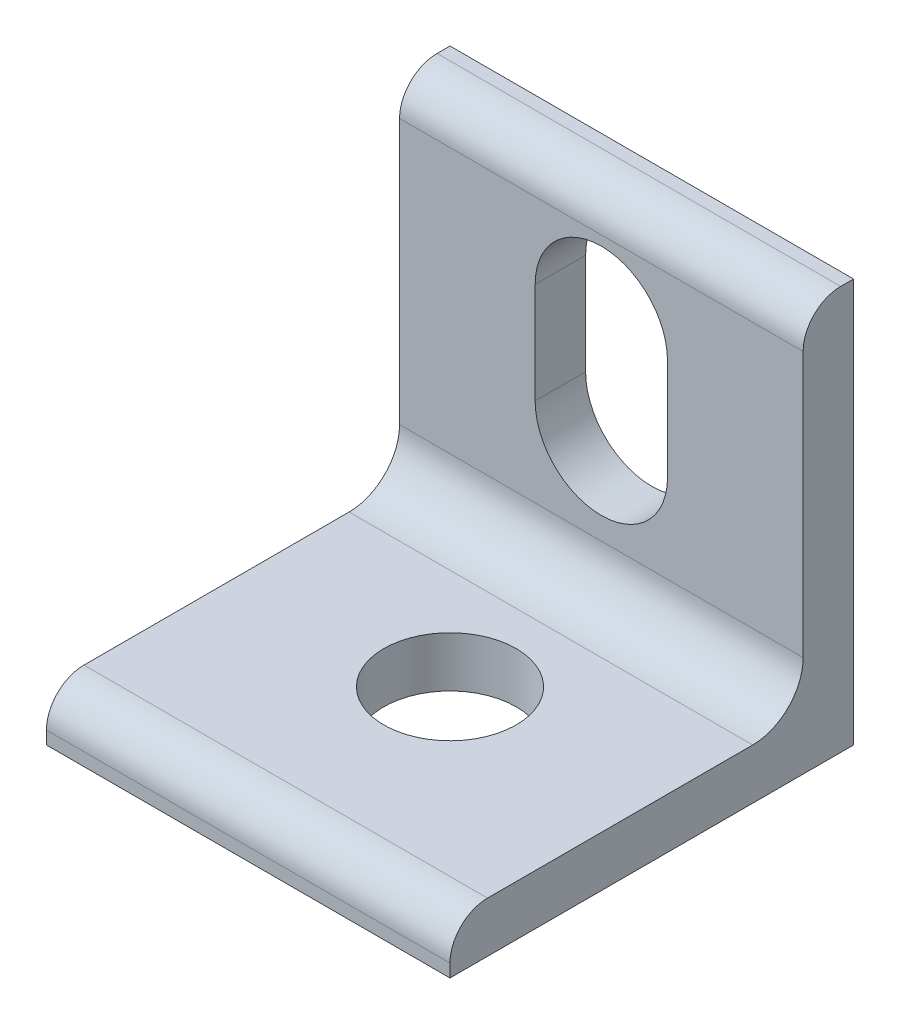
ISO-10303-21;
HEADER;
FILE_DESCRIPTION(('STEP AP214'),'2;1');
FILE_NAME('part.step','',(''),(''),'','','');
FILE_SCHEMA(('AUTOMOTIVE_DESIGN { 1 0 10303 214 1 1 1 1 }'));
ENDSEC;
DATA;
#1=APPLICATION_CONTEXT('core data for automotive mechanical design processes');
#2=APPLICATION_PROTOCOL_DEFINITION('international standard','automotive_design',2000,#1);
#3=PRODUCT_CONTEXT('',#1,'mechanical');
#4=PRODUCT('Part','Part','',(#3));
#5=PRODUCT_RELATED_PRODUCT_CATEGORY('part','',(#4));
#6=PRODUCT_DEFINITION_FORMATION('','',#4);
#7=PRODUCT_DEFINITION_CONTEXT('part definition',#1,'design');
#8=PRODUCT_DEFINITION('design','',#6,#7);
#9=PRODUCT_DEFINITION_SHAPE('','',#8);
#10=(LENGTH_UNIT() NAMED_UNIT(*) SI_UNIT(.MILLI.,.METRE.));
#11=(NAMED_UNIT(*) PLANE_ANGLE_UNIT() SI_UNIT($,.RADIAN.));
#12=(NAMED_UNIT(*) SI_UNIT($,.STERADIAN.) SOLID_ANGLE_UNIT());
#13=UNCERTAINTY_MEASURE_WITH_UNIT(LENGTH_MEASURE(1.E-05),#10,'distance_accuracy_value','');
#14=(GEOMETRIC_REPRESENTATION_CONTEXT(3) GLOBAL_UNCERTAINTY_ASSIGNED_CONTEXT((#13)) GLOBAL_UNIT_ASSIGNED_CONTEXT((#10,
#11,#12)) REPRESENTATION_CONTEXT('',''));
#15=CARTESIAN_POINT('',(0.,0.,0.));
#16=DIRECTION('',(0.,0.,1.));
#17=DIRECTION('',(1.,0.,0.));
#18=AXIS2_PLACEMENT_3D('',#15,#16,#17);
#19=CARTESIAN_POINT('',(-12.7,0.,0.));
#20=DIRECTION('',(0.,0.,-1.));
#21=DIRECTION('',(-1.,0.,0.));
#22=AXIS2_PLACEMENT_3D('',#19,#20,#21);
#23=PLANE('',#22);
#24=CARTESIAN_POINT('',(0.,18.2626,0.));
#25=DIRECTION('',(0.,0.,-1.));
#26=DIRECTION('',(-1.,0.,0.));
#27=AXIS2_PLACEMENT_3D('',#24,#25,#26);
#28=CIRCLE('',#27,4.1656);
#29=CARTESIAN_POINT('',(-4.1656,18.2626,0.));
#30=VERTEX_POINT('',#29);
#31=CARTESIAN_POINT('',(4.1656,18.2626,0.));
#32=VERTEX_POINT('',#31);
#33=EDGE_CURVE('E149',#30,#32,#28,.T.);
#34=ORIENTED_EDGE('',*,*,#33,.F.);
#35=DIRECTION('',(0.,1.,0.));
#36=VECTOR('',#35,1.);
#37=CARTESIAN_POINT('',(-4.1656,11.9126,0.));
#38=LINE('',#37,#36);
#39=CARTESIAN_POINT('',(-4.1656,11.9126,0.));
#40=VERTEX_POINT('',#39);
#41=EDGE_CURVE('E153',#40,#30,#38,.T.);
#42=ORIENTED_EDGE('',*,*,#41,.F.);
#43=CARTESIAN_POINT('',(0.,11.9126,0.));
#44=DIRECTION('',(0.,0.,-1.));
#45=DIRECTION('',(-1.,0.,0.));
#46=AXIS2_PLACEMENT_3D('',#43,#44,#45);
#47=CIRCLE('',#46,4.1656);
#48=CARTESIAN_POINT('',(4.1656,11.9126,0.));
#49=VERTEX_POINT('',#48);
#50=EDGE_CURVE('E133',#49,#40,#47,.T.);
#51=ORIENTED_EDGE('',*,*,#50,.F.);
#52=DIRECTION('',(0.,-1.,0.));
#53=VECTOR('',#52,1.);
#54=CARTESIAN_POINT('',(4.1656,18.2626,0.));
#55=LINE('',#54,#53);
#56=EDGE_CURVE('E144',#32,#49,#55,.T.);
#57=ORIENTED_EDGE('',*,*,#56,.F.);
#58=EDGE_LOOP('',(#34,#42,#51,#57));
#59=FACE_BOUND('',#58,.T.);
#60=DIRECTION('',(0.,1.,0.));
#61=VECTOR('',#60,1.);
#62=CARTESIAN_POINT('',(12.7,0.,0.));
#63=LINE('',#62,#61);
#64=CARTESIAN_POINT('',(12.7,0.,0.));
#65=VERTEX_POINT('',#64);
#66=CARTESIAN_POINT('',(12.7,25.4,0.));
#67=VERTEX_POINT('',#66);
#68=EDGE_CURVE('E168',#65,#67,#63,.T.);
#69=ORIENTED_EDGE('',*,*,#68,.F.);
#70=DIRECTION('',(1.,0.,0.));
#71=VECTOR('',#70,1.);
#72=CARTESIAN_POINT('',(-12.7,0.,0.));
#73=LINE('',#72,#71);
#74=CARTESIAN_POINT('',(-12.7,0.,0.));
#75=VERTEX_POINT('',#74);
#76=EDGE_CURVE('E193',#75,#65,#73,.T.);
#77=ORIENTED_EDGE('',*,*,#76,.F.);
#78=DIRECTION('',(0.,1.,0.));
#79=VECTOR('',#78,1.);
#80=CARTESIAN_POINT('',(-12.7,0.,0.));
#81=LINE('',#80,#79);
#82=CARTESIAN_POINT('',(-12.7,25.4,0.));
#83=VERTEX_POINT('',#82);
#84=EDGE_CURVE('E171',#75,#83,#81,.T.);
#85=ORIENTED_EDGE('',*,*,#84,.T.);
#86=DIRECTION('',(1.,0.,0.));
#87=VECTOR('',#86,1.);
#88=CARTESIAN_POINT('',(-12.7,25.4,0.));
#89=LINE('',#88,#87);
#90=EDGE_CURVE('E183',#83,#67,#89,.T.);
#91=ORIENTED_EDGE('',*,*,#90,.T.);
#92=EDGE_LOOP('',(#69,#77,#85,#91));
#93=FACE_BOUND('',#92,.T.);
#94=ADVANCED_FACE('F33',(#59,#93),#23,.T.);
#95=CARTESIAN_POINT('',(-12.7,0.,25.4));
#96=DIRECTION('',(0.,-1.,0.));
#97=DIRECTION('',(0.,0.,-1.));
#98=AXIS2_PLACEMENT_3D('',#95,#96,#97);
#99=PLANE('',#98);
#100=CARTESIAN_POINT('',(0.,0.,12.7));
#101=DIRECTION('',(0.,-1.,0.));
#102=DIRECTION('',(0.,0.,-1.));
#103=AXIS2_PLACEMENT_3D('',#100,#101,#102);
#104=CIRCLE('',#103,4.16559999999999);
#105=CARTESIAN_POINT('',(0.,0.,8.53440000000001));
#106=VERTEX_POINT('',#105);
#107=EDGE_CURVE('E212',#106,#106,#104,.T.);
#108=ORIENTED_EDGE('',*,*,#107,.F.);
#109=EDGE_LOOP('',(#108));
#110=FACE_BOUND('',#109,.T.);
#111=DIRECTION('',(0.,0.,-1.));
#112=VECTOR('',#111,1.);
#113=CARTESIAN_POINT('',(12.7,0.,25.4));
#114=LINE('',#113,#112);
#115=CARTESIAN_POINT('',(12.7,0.,25.4));
#116=VERTEX_POINT('',#115);
#117=EDGE_CURVE('E175',#116,#65,#114,.T.);
#118=ORIENTED_EDGE('',*,*,#117,.F.);
#119=DIRECTION('',(1.,0.,0.));
#120=VECTOR('',#119,1.);
#121=CARTESIAN_POINT('',(-12.7,0.,25.4));
#122=LINE('',#121,#120);
#123=CARTESIAN_POINT('',(-12.7,0.,25.4));
#124=VERTEX_POINT('',#123);
#125=EDGE_CURVE('E196',#124,#116,#122,.T.);
#126=ORIENTED_EDGE('',*,*,#125,.F.);
#127=DIRECTION('',(0.,0.,-1.));
#128=VECTOR('',#127,1.);
#129=CARTESIAN_POINT('',(-12.7,0.,25.4));
#130=LINE('',#129,#128);
#131=EDGE_CURVE('E180',#124,#75,#130,.T.);
#132=ORIENTED_EDGE('',*,*,#131,.T.);
#133=ORIENTED_EDGE('',*,*,#76,.T.);
#134=EDGE_LOOP('',(#118,#126,#132,#133));
#135=FACE_BOUND('',#134,.T.);
#136=ADVANCED_FACE('F257',(#110,#135),#99,.T.);
#137=CARTESIAN_POINT('',(-12.7,25.4,25.4));
#138=DIRECTION('',(0.,0.,1.));
#139=DIRECTION('',(1.,0.,0.));
#140=AXIS2_PLACEMENT_3D('',#137,#138,#139);
#141=PLANE('',#140);
#142=DIRECTION('',(0.,-1.,0.));
#143=VECTOR('',#142,1.);
#144=CARTESIAN_POINT('',(12.7,25.4,25.4));
#145=LINE('',#144,#143);
#146=CARTESIAN_POINT('',(12.7,0.812800000000002,25.4));
#147=VERTEX_POINT('',#146);
#148=EDGE_CURVE('E189',#147,#116,#145,.T.);
#149=ORIENTED_EDGE('',*,*,#148,.F.);
#150=DIRECTION('',(-1.,0.,0.));
#151=VECTOR('',#150,1.);
#152=CARTESIAN_POINT('',(-12.7,0.812800000000002,25.4));
#153=LINE('',#152,#151);
#154=CARTESIAN_POINT('',(-12.7,0.812800000000002,25.4));
#155=VERTEX_POINT('',#154);
#156=EDGE_CURVE('E208',#147,#155,#153,.T.);
#157=ORIENTED_EDGE('',*,*,#156,.T.);
#158=DIRECTION('',(0.,-1.,0.));
#159=VECTOR('',#158,1.);
#160=CARTESIAN_POINT('',(-12.7,25.4,25.4));
#161=LINE('',#160,#159);
#162=EDGE_CURVE('E178',#155,#124,#161,.T.);
#163=ORIENTED_EDGE('',*,*,#162,.T.);
#164=ORIENTED_EDGE('',*,*,#125,.T.);
#165=EDGE_LOOP('',(#149,#157,#163,#164));
#166=FACE_BOUND('',#165,.T.);
#167=ADVANCED_FACE('F253',(#166),#141,.T.);
#168=CARTESIAN_POINT('',(-12.7,25.4,0.));
#169=DIRECTION('',(0.,1.,0.));
#170=DIRECTION('',(0.,0.,1.));
#171=AXIS2_PLACEMENT_3D('',#168,#169,#170);
#172=PLANE('',#171);
#173=DIRECTION('',(0.,0.,1.));
#174=VECTOR('',#173,1.);
#175=CARTESIAN_POINT('',(-12.7,25.4,0.));
#176=LINE('',#175,#174);
#177=CARTESIAN_POINT('',(-12.7,25.4,0.812800000000002));
#178=VERTEX_POINT('',#177);
#179=EDGE_CURVE('E174',#83,#178,#176,.T.);
#180=ORIENTED_EDGE('',*,*,#179,.T.);
#181=DIRECTION('',(-1.,0.,0.));
#182=VECTOR('',#181,1.);
#183=CARTESIAN_POINT('',(12.7,25.4,0.812800000000002));
#184=LINE('',#183,#182);
#185=CARTESIAN_POINT('',(12.7,25.4,0.812800000000002));
#186=VERTEX_POINT('',#185);
#187=EDGE_CURVE('E230',#178,#186,#184,.F.);
#188=ORIENTED_EDGE('',*,*,#187,.T.);
#189=DIRECTION('',(0.,0.,1.));
#190=VECTOR('',#189,1.);
#191=CARTESIAN_POINT('',(12.7,25.4,0.));
#192=LINE('',#191,#190);
#193=EDGE_CURVE('E186',#67,#186,#192,.T.);
#194=ORIENTED_EDGE('',*,*,#193,.F.);
#195=ORIENTED_EDGE('',*,*,#90,.F.);
#196=EDGE_LOOP('',(#180,#188,#194,#195));
#197=FACE_BOUND('',#196,.T.);
#198=ADVANCED_FACE('F264',(#197),#172,.T.);
#199=CARTESIAN_POINT('',(-12.7,0.,0.));
#200=DIRECTION('',(1.,0.,0.));
#201=DIRECTION('',(0.,0.,-1.));
#202=AXIS2_PLACEMENT_3D('',#199,#200,#201);
#203=PLANE('',#202);
#204=ORIENTED_EDGE('',*,*,#162,.F.);
#205=CARTESIAN_POINT('',(-12.7,0.812800000000002,23.0378));
#206=DIRECTION('',(1.,0.,0.));
#207=DIRECTION('',(0.,0.,-1.));
#208=AXIS2_PLACEMENT_3D('',#205,#206,#207);
#209=CIRCLE('',#208,2.3622);
#210=CARTESIAN_POINT('',(-12.7,3.175,23.0378));
#211=VERTEX_POINT('',#210);
#212=EDGE_CURVE('E217',#155,#211,#209,.F.);
#213=ORIENTED_EDGE('',*,*,#212,.T.);
#214=DIRECTION('',(0.,0.,1.));
#215=VECTOR('',#214,1.);
#216=CARTESIAN_POINT('',(-12.7,3.175,3.175));
#217=LINE('',#216,#215);
#218=CARTESIAN_POINT('',(-12.7,3.175,6.35));
#219=VERTEX_POINT('',#218);
#220=EDGE_CURVE('E166',#219,#211,#217,.T.);
#221=ORIENTED_EDGE('',*,*,#220,.F.);
#222=CARTESIAN_POINT('',(-12.7,6.35,6.35));
#223=DIRECTION('',(1.,0.,0.));
#224=DIRECTION('',(0.,0.,-1.));
#225=AXIS2_PLACEMENT_3D('',#222,#223,#224);
#226=CIRCLE('',#225,3.175);
#227=CARTESIAN_POINT('',(-12.7,6.35,3.175));
#228=VERTEX_POINT('',#227);
#229=EDGE_CURVE('E41',#219,#228,#226,.T.);
#230=ORIENTED_EDGE('',*,*,#229,.T.);
#231=DIRECTION('',(0.,-1.,0.));
#232=VECTOR('',#231,1.);
#233=CARTESIAN_POINT('',(-12.7,25.4,3.175));
#234=LINE('',#233,#232);
#235=CARTESIAN_POINT('',(-12.7,23.0378,3.175));
#236=VERTEX_POINT('',#235);
#237=EDGE_CURVE('E160',#236,#228,#234,.T.);
#238=ORIENTED_EDGE('',*,*,#237,.F.);
#239=CARTESIAN_POINT('',(-12.7,23.0378,0.812800000000002));
#240=DIRECTION('',(1.,0.,0.));
#241=DIRECTION('',(0.,0.,-1.));
#242=AXIS2_PLACEMENT_3D('',#239,#240,#241);
#243=CIRCLE('',#242,2.3622);
#244=EDGE_CURVE('E215',#236,#178,#243,.F.);
#245=ORIENTED_EDGE('',*,*,#244,.T.);
#246=ORIENTED_EDGE('',*,*,#179,.F.);
#247=ORIENTED_EDGE('',*,*,#84,.F.);
#248=ORIENTED_EDGE('',*,*,#131,.F.);
#249=EDGE_LOOP('',(#204,#213,#221,#230,#238,#245,#246,#247,#248));
#250=FACE_BOUND('',#249,.T.);
#251=ADVANCED_FACE('F242',(#250),#203,.F.);
#252=CARTESIAN_POINT('',(12.7,0.,0.));
#253=DIRECTION('',(1.,0.,0.));
#254=DIRECTION('',(0.,0.,-1.));
#255=AXIS2_PLACEMENT_3D('',#252,#253,#254);
#256=PLANE('',#255);
#257=DIRECTION('',(0.,-1.,0.));
#258=VECTOR('',#257,1.);
#259=CARTESIAN_POINT('',(12.7,25.4,3.175));
#260=LINE('',#259,#258);
#261=CARTESIAN_POINT('',(12.7,23.0378,3.175));
#262=VERTEX_POINT('',#261);
#263=CARTESIAN_POINT('',(12.7,6.35,3.175));
#264=VERTEX_POINT('',#263);
#265=EDGE_CURVE('E163',#262,#264,#260,.T.);
#266=ORIENTED_EDGE('',*,*,#265,.T.);
#267=CARTESIAN_POINT('',(12.7,6.35,6.35));
#268=DIRECTION('',(1.,0.,0.));
#269=DIRECTION('',(0.,0.,-1.));
#270=AXIS2_PLACEMENT_3D('',#267,#268,#269);
#271=CIRCLE('',#270,3.175);
#272=CARTESIAN_POINT('',(12.7,3.175,6.35));
#273=VERTEX_POINT('',#272);
#274=EDGE_CURVE('E11',#264,#273,#271,.F.);
#275=ORIENTED_EDGE('',*,*,#274,.T.);
#276=DIRECTION('',(0.,0.,1.));
#277=VECTOR('',#276,1.);
#278=CARTESIAN_POINT('',(12.7,3.175,3.175));
#279=LINE('',#278,#277);
#280=CARTESIAN_POINT('',(12.7,3.175,23.0378));
#281=VERTEX_POINT('',#280);
#282=EDGE_CURVE('E165',#273,#281,#279,.T.);
#283=ORIENTED_EDGE('',*,*,#282,.T.);
#284=CARTESIAN_POINT('',(12.7,0.812800000000002,23.0378));
#285=DIRECTION('',(1.,0.,0.));
#286=DIRECTION('',(0.,0.,-1.));
#287=AXIS2_PLACEMENT_3D('',#284,#285,#286);
#288=CIRCLE('',#287,2.3622);
#289=EDGE_CURVE('E225',#281,#147,#288,.T.);
#290=ORIENTED_EDGE('',*,*,#289,.T.);
#291=ORIENTED_EDGE('',*,*,#148,.T.);
#292=ORIENTED_EDGE('',*,*,#117,.T.);
#293=ORIENTED_EDGE('',*,*,#68,.T.);
#294=ORIENTED_EDGE('',*,*,#193,.T.);
#295=CARTESIAN_POINT('',(12.7,23.0378,0.812800000000002));
#296=DIRECTION('',(1.,0.,0.));
#297=DIRECTION('',(0.,0.,-1.));
#298=AXIS2_PLACEMENT_3D('',#295,#296,#297);
#299=CIRCLE('',#298,2.3622);
#300=EDGE_CURVE('E223',#186,#262,#299,.T.);
#301=ORIENTED_EDGE('',*,*,#300,.T.);
#302=EDGE_LOOP('',(#266,#275,#283,#290,#291,#292,#293,#294,#301));
#303=FACE_BOUND('',#302,.T.);
#304=ADVANCED_FACE('F251',(#303),#256,.T.);
#305=CARTESIAN_POINT('',(12.7,25.4,3.175));
#306=DIRECTION('',(0.,0.,-1.));
#307=DIRECTION('',(-1.,0.,0.));
#308=AXIS2_PLACEMENT_3D('',#305,#306,#307);
#309=PLANE('',#308);
#310=DIRECTION('',(0.,1.,0.));
#311=VECTOR('',#310,1.);
#312=CARTESIAN_POINT('',(-4.1656,25.4,3.175));
#313=LINE('',#312,#311);
#314=CARTESIAN_POINT('',(-4.1656,11.9126,3.175));
#315=VERTEX_POINT('',#314);
#316=CARTESIAN_POINT('',(-4.1656,18.2626,3.175));
#317=VERTEX_POINT('',#316);
#318=EDGE_CURVE('E202',#315,#317,#313,.T.);
#319=ORIENTED_EDGE('',*,*,#318,.T.);
#320=CARTESIAN_POINT('',(0.,18.2626,3.175));
#321=DIRECTION('',(0.,0.,-1.));
#322=DIRECTION('',(-1.,0.,0.));
#323=AXIS2_PLACEMENT_3D('',#320,#321,#322);
#324=CIRCLE('',#323,4.1656);
#325=CARTESIAN_POINT('',(4.1656,18.2626,3.175));
#326=VERTEX_POINT('',#325);
#327=EDGE_CURVE('E205',#317,#326,#324,.T.);
#328=ORIENTED_EDGE('',*,*,#327,.T.);
#329=DIRECTION('',(0.,-1.,0.));
#330=VECTOR('',#329,1.);
#331=CARTESIAN_POINT('',(4.1656,25.4,3.175));
#332=LINE('',#331,#330);
#333=CARTESIAN_POINT('',(4.1656,11.9126,3.175));
#334=VERTEX_POINT('',#333);
#335=EDGE_CURVE('E195',#326,#334,#332,.T.);
#336=ORIENTED_EDGE('',*,*,#335,.T.);
#337=CARTESIAN_POINT('',(0.,11.9126,3.175));
#338=DIRECTION('',(0.,0.,-1.));
#339=DIRECTION('',(-1.,0.,0.));
#340=AXIS2_PLACEMENT_3D('',#337,#338,#339);
#341=CIRCLE('',#340,4.1656);
#342=EDGE_CURVE('E136',#334,#315,#341,.T.);
#343=ORIENTED_EDGE('',*,*,#342,.T.);
#344=EDGE_LOOP('',(#319,#328,#336,#343));
#345=FACE_BOUND('',#344,.T.);
#346=ORIENTED_EDGE('',*,*,#237,.T.);
#347=DIRECTION('',(-1.,0.,0.));
#348=VECTOR('',#347,1.);
#349=CARTESIAN_POINT('',(12.7,6.35,3.175));
#350=LINE('',#349,#348);
#351=EDGE_CURVE('E54',#228,#264,#350,.F.);
#352=ORIENTED_EDGE('',*,*,#351,.T.);
#353=ORIENTED_EDGE('',*,*,#265,.F.);
#354=DIRECTION('',(-1.,0.,0.));
#355=VECTOR('',#354,1.);
#356=CARTESIAN_POINT('',(-12.7,23.0378,3.175));
#357=LINE('',#356,#355);
#358=EDGE_CURVE('E227',#262,#236,#357,.T.);
#359=ORIENTED_EDGE('',*,*,#358,.T.);
#360=EDGE_LOOP('',(#346,#352,#353,#359));
#361=FACE_BOUND('',#360,.T.);
#362=ADVANCED_FACE('F269',(#345,#361),#309,.F.);
#363=CARTESIAN_POINT('',(12.7,3.175,3.175));
#364=DIRECTION('',(0.,-1.,0.));
#365=DIRECTION('',(0.,0.,-1.));
#366=AXIS2_PLACEMENT_3D('',#363,#364,#365);
#367=PLANE('',#366);
#368=CARTESIAN_POINT('',(0.,3.175,12.7));
#369=DIRECTION('',(0.,-1.,0.));
#370=DIRECTION('',(0.,0.,-1.));
#371=AXIS2_PLACEMENT_3D('',#368,#369,#370);
#372=CIRCLE('',#371,4.16559999999999);
#373=CARTESIAN_POINT('',(0.,3.175,8.53440000000001));
#374=VERTEX_POINT('',#373);
#375=EDGE_CURVE('E209',#374,#374,#372,.T.);
#376=ORIENTED_EDGE('',*,*,#375,.T.);
#377=EDGE_LOOP('',(#376));
#378=FACE_BOUND('',#377,.T.);
#379=ORIENTED_EDGE('',*,*,#282,.F.);
#380=DIRECTION('',(-1.,0.,0.));
#381=VECTOR('',#380,1.);
#382=CARTESIAN_POINT('',(-12.7,3.175,6.35));
#383=LINE('',#382,#381);
#384=EDGE_CURVE('E232',#273,#219,#383,.T.);
#385=ORIENTED_EDGE('',*,*,#384,.T.);
#386=ORIENTED_EDGE('',*,*,#220,.T.);
#387=DIRECTION('',(-1.,0.,0.));
#388=VECTOR('',#387,1.);
#389=CARTESIAN_POINT('',(12.7,3.175,23.0378));
#390=LINE('',#389,#388);
#391=EDGE_CURVE('E220',#211,#281,#390,.F.);
#392=ORIENTED_EDGE('',*,*,#391,.T.);
#393=EDGE_LOOP('',(#379,#385,#386,#392));
#394=FACE_BOUND('',#393,.T.);
#395=ADVANCED_FACE('F238',(#378,#394),#367,.F.);
#396=CARTESIAN_POINT('',(0.,18.2626,25.4));
#397=DIRECTION('',(0.,0.,-1.));
#398=DIRECTION('',(-1.,0.,0.));
#399=AXIS2_PLACEMENT_3D('',#396,#397,#398);
#400=CYLINDRICAL_SURFACE('',#399,4.1656);
#401=DIRECTION('',(0.,0.,-1.));
#402=VECTOR('',#401,1.);
#403=CARTESIAN_POINT('',(-4.1656,18.2626,25.4));
#404=LINE('',#403,#402);
#405=EDGE_CURVE('E158',#317,#30,#404,.T.);
#406=ORIENTED_EDGE('',*,*,#405,.T.);
#407=ORIENTED_EDGE('',*,*,#33,.T.);
#408=DIRECTION('',(0.,0.,-1.));
#409=VECTOR('',#408,1.);
#410=CARTESIAN_POINT('',(4.1656,18.2626,25.4));
#411=LINE('',#410,#409);
#412=EDGE_CURVE('E140',#326,#32,#411,.T.);
#413=ORIENTED_EDGE('',*,*,#412,.F.);
#414=ORIENTED_EDGE('',*,*,#327,.F.);
#415=EDGE_LOOP('',(#406,#407,#413,#414));
#416=FACE_BOUND('',#415,.T.);
#417=ADVANCED_FACE('F301',(#416),#400,.F.);
#418=CARTESIAN_POINT('',(-4.1656,11.9126,25.4));
#419=DIRECTION('',(-1.,0.,0.));
#420=DIRECTION('',(0.,0.,1.));
#421=AXIS2_PLACEMENT_3D('',#418,#419,#420);
#422=PLANE('',#421);
#423=DIRECTION('',(0.,0.,-1.));
#424=VECTOR('',#423,1.);
#425=CARTESIAN_POINT('',(-4.1656,11.9126,25.4));
#426=LINE('',#425,#424);
#427=EDGE_CURVE('E139',#315,#40,#426,.T.);
#428=ORIENTED_EDGE('',*,*,#427,.T.);
#429=ORIENTED_EDGE('',*,*,#41,.T.);
#430=ORIENTED_EDGE('',*,*,#405,.F.);
#431=ORIENTED_EDGE('',*,*,#318,.F.);
#432=EDGE_LOOP('',(#428,#429,#430,#431));
#433=FACE_BOUND('',#432,.T.);
#434=ADVANCED_FACE('F298',(#433),#422,.F.);
#435=CARTESIAN_POINT('',(0.,11.9126,25.4));
#436=DIRECTION('',(0.,0.,-1.));
#437=DIRECTION('',(-1.,0.,0.));
#438=AXIS2_PLACEMENT_3D('',#435,#436,#437);
#439=CYLINDRICAL_SURFACE('',#438,4.1656);
#440=DIRECTION('',(0.,0.,-1.));
#441=VECTOR('',#440,1.);
#442=CARTESIAN_POINT('',(4.1656,11.9126,25.4));
#443=LINE('',#442,#441);
#444=EDGE_CURVE('E128',#334,#49,#443,.T.);
#445=ORIENTED_EDGE('',*,*,#444,.T.);
#446=ORIENTED_EDGE('',*,*,#50,.T.);
#447=ORIENTED_EDGE('',*,*,#427,.F.);
#448=ORIENTED_EDGE('',*,*,#342,.F.);
#449=EDGE_LOOP('',(#445,#446,#447,#448));
#450=FACE_BOUND('',#449,.T.);
#451=ADVANCED_FACE('F130',(#450),#439,.F.);
#452=CARTESIAN_POINT('',(4.1656,18.2626,25.4));
#453=DIRECTION('',(1.,0.,0.));
#454=DIRECTION('',(0.,0.,-1.));
#455=AXIS2_PLACEMENT_3D('',#452,#453,#454);
#456=PLANE('',#455);
#457=ORIENTED_EDGE('',*,*,#412,.T.);
#458=ORIENTED_EDGE('',*,*,#56,.T.);
#459=ORIENTED_EDGE('',*,*,#444,.F.);
#460=ORIENTED_EDGE('',*,*,#335,.F.);
#461=EDGE_LOOP('',(#457,#458,#459,#460));
#462=FACE_BOUND('',#461,.T.);
#463=ADVANCED_FACE('F145',(#462),#456,.F.);
#464=CARTESIAN_POINT('',(0.,0.,12.7));
#465=DIRECTION('',(0.,-1.,0.));
#466=DIRECTION('',(0.,0.,-1.));
#467=AXIS2_PLACEMENT_3D('',#464,#465,#466);
#468=CYLINDRICAL_SURFACE('',#467,4.16559999999999);
#469=ORIENTED_EDGE('',*,*,#107,.T.);
#470=EDGE_LOOP('',(#469));
#471=FACE_BOUND('',#470,.T.);
#472=ORIENTED_EDGE('',*,*,#375,.F.);
#473=EDGE_LOOP('',(#472));
#474=FACE_BOUND('',#473,.T.);
#475=ADVANCED_FACE('F285',(#471,#474),#468,.F.);
#476=CARTESIAN_POINT('',(-12.7,0.812800000000002,23.0378));
#477=DIRECTION('',(1.,0.,0.));
#478=DIRECTION('',(0.,0.,-1.));
#479=AXIS2_PLACEMENT_3D('',#476,#477,#478);
#480=CYLINDRICAL_SURFACE('',#479,2.3622);
#481=ORIENTED_EDGE('',*,*,#289,.F.);
#482=ORIENTED_EDGE('',*,*,#391,.F.);
#483=ORIENTED_EDGE('',*,*,#212,.F.);
#484=ORIENTED_EDGE('',*,*,#156,.F.);
#485=EDGE_LOOP('',(#481,#482,#483,#484));
#486=FACE_BOUND('',#485,.T.);
#487=ADVANCED_FACE('F248',(#486),#480,.T.);
#488=CARTESIAN_POINT('',(12.7,23.0378,0.812800000000002));
#489=DIRECTION('',(1.,0.,0.));
#490=DIRECTION('',(0.,0.,-1.));
#491=AXIS2_PLACEMENT_3D('',#488,#489,#490);
#492=CYLINDRICAL_SURFACE('',#491,2.3622);
#493=ORIENTED_EDGE('',*,*,#300,.F.);
#494=ORIENTED_EDGE('',*,*,#187,.F.);
#495=ORIENTED_EDGE('',*,*,#244,.F.);
#496=ORIENTED_EDGE('',*,*,#358,.F.);
#497=EDGE_LOOP('',(#493,#494,#495,#496));
#498=FACE_BOUND('',#497,.T.);
#499=ADVANCED_FACE('F267',(#498),#492,.T.);
#500=CARTESIAN_POINT('',(12.7,6.35,6.35));
#501=DIRECTION('',(1.,0.,0.));
#502=DIRECTION('',(0.,0.,-1.));
#503=AXIS2_PLACEMENT_3D('',#500,#501,#502);
#504=CYLINDRICAL_SURFACE('',#503,3.175);
#505=ORIENTED_EDGE('',*,*,#274,.F.);
#506=ORIENTED_EDGE('',*,*,#351,.F.);
#507=ORIENTED_EDGE('',*,*,#229,.F.);
#508=ORIENTED_EDGE('',*,*,#384,.F.);
#509=EDGE_LOOP('',(#505,#506,#507,#508));
#510=FACE_BOUND('',#509,.T.);
#511=ADVANCED_FACE('F35',(#510),#504,.F.);
#512=CLOSED_SHELL('',(#94,#136,#167,#198,#251,#304,#362,#395,#417,#434,#451,#463,#475,#487,#499,#511));
#513=MANIFOLD_SOLID_BREP('B2',#512);
#514=ADVANCED_BREP_SHAPE_REPRESENTATION('',(#18,#513),#14);
#515=SHAPE_DEFINITION_REPRESENTATION(#9,#514);
ENDSEC;
END-ISO-10303-21;
